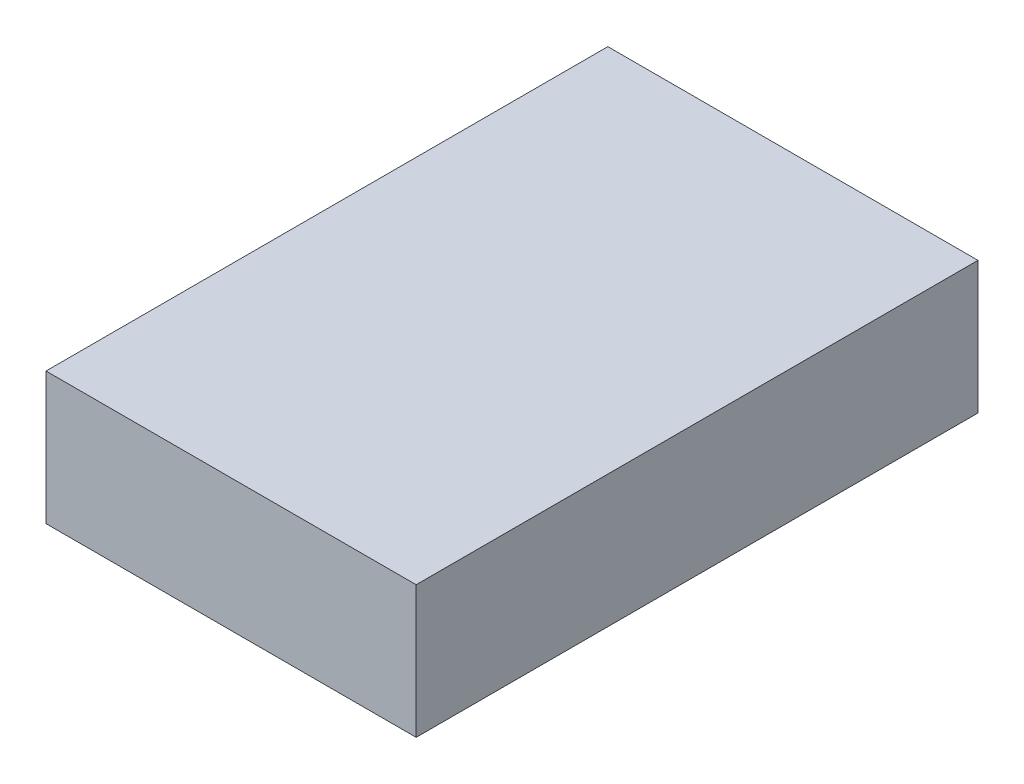
ISO-10303-21;
HEADER;
FILE_DESCRIPTION(('STEP AP214'),'2;1');
FILE_NAME('part.step','',(''),(''),'','','');
FILE_SCHEMA(('AUTOMOTIVE_DESIGN { 1 0 10303 214 1 1 1 1 }'));
ENDSEC;
DATA;
#1=APPLICATION_CONTEXT('core data for automotive mechanical design processes');
#2=APPLICATION_PROTOCOL_DEFINITION('international standard','automotive_design',2000,#1);
#3=PRODUCT_CONTEXT('',#1,'mechanical');
#4=PRODUCT('Part','Part','',(#3));
#5=PRODUCT_RELATED_PRODUCT_CATEGORY('part','',(#4));
#6=PRODUCT_DEFINITION_FORMATION('','',#4);
#7=PRODUCT_DEFINITION_CONTEXT('part definition',#1,'design');
#8=PRODUCT_DEFINITION('design','',#6,#7);
#9=PRODUCT_DEFINITION_SHAPE('','',#8);
#10=(LENGTH_UNIT() NAMED_UNIT(*) SI_UNIT(.MILLI.,.METRE.));
#11=(NAMED_UNIT(*) PLANE_ANGLE_UNIT() SI_UNIT($,.RADIAN.));
#12=(NAMED_UNIT(*) SI_UNIT($,.STERADIAN.) SOLID_ANGLE_UNIT());
#13=UNCERTAINTY_MEASURE_WITH_UNIT(LENGTH_MEASURE(1.E-05),#10,'distance_accuracy_value','');
#14=(GEOMETRIC_REPRESENTATION_CONTEXT(3) GLOBAL_UNCERTAINTY_ASSIGNED_CONTEXT((#13)) GLOBAL_UNIT_ASSIGNED_CONTEXT((#10,
#11,#12)) REPRESENTATION_CONTEXT('',''));
#15=CARTESIAN_POINT('',(0.,0.,0.));
#16=DIRECTION('',(0.,0.,1.));
#17=DIRECTION('',(1.,0.,0.));
#18=AXIS2_PLACEMENT_3D('',#15,#16,#17);
#19=CARTESIAN_POINT('',(0.,40.,0.));
#20=DIRECTION('',(1.,0.,0.));
#21=DIRECTION('',(0.,0.,-1.));
#22=AXIS2_PLACEMENT_3D('',#19,#20,#21);
#23=PLANE('',#22);
#24=DIRECTION('',(0.,0.,1.));
#25=VECTOR('',#24,1.);
#26=CARTESIAN_POINT('',(0.,0.,0.));
#27=LINE('',#26,#25);
#28=CARTESIAN_POINT('',(0.,0.,-170.));
#29=VERTEX_POINT('',#28);
#30=CARTESIAN_POINT('',(0.,0.,0.));
#31=VERTEX_POINT('',#30);
#32=EDGE_CURVE('E113',#29,#31,#27,.T.);
#33=ORIENTED_EDGE('',*,*,#32,.T.);
#34=DIRECTION('',(0.,-1.,0.));
#35=VECTOR('',#34,1.);
#36=CARTESIAN_POINT('',(0.,40.,0.));
#37=LINE('',#36,#35);
#38=CARTESIAN_POINT('',(0.,40.,0.));
#39=VERTEX_POINT('',#38);
#40=EDGE_CURVE('E11',#39,#31,#37,.T.);
#41=ORIENTED_EDGE('',*,*,#40,.F.);
#42=DIRECTION('',(0.,0.,1.));
#43=VECTOR('',#42,1.);
#44=CARTESIAN_POINT('',(0.,40.,0.));
#45=LINE('',#44,#43);
#46=CARTESIAN_POINT('',(0.,40.,-170.));
#47=VERTEX_POINT('',#46);
#48=EDGE_CURVE('E97',#47,#39,#45,.T.);
#49=ORIENTED_EDGE('',*,*,#48,.F.);
#50=DIRECTION('',(0.,-1.,0.));
#51=VECTOR('',#50,1.);
#52=CARTESIAN_POINT('',(0.,40.,-170.));
#53=LINE('',#52,#51);
#54=EDGE_CURVE('E109',#47,#29,#53,.T.);
#55=ORIENTED_EDGE('',*,*,#54,.T.);
#56=EDGE_LOOP('',(#33,#41,#49,#55));
#57=FACE_BOUND('',#56,.T.);
#58=ADVANCED_FACE('F45',(#57),#23,.F.);
#59=CARTESIAN_POINT('',(0.,40.,0.));
#60=DIRECTION('',(0.,0.,-1.));
#61=DIRECTION('',(-1.,0.,0.));
#62=AXIS2_PLACEMENT_3D('',#59,#60,#61);
#63=PLANE('',#62);
#64=DIRECTION('',(1.,0.,0.));
#65=VECTOR('',#64,1.);
#66=CARTESIAN_POINT('',(0.,0.,0.));
#67=LINE('',#66,#65);
#68=CARTESIAN_POINT('',(112.,0.,0.));
#69=VERTEX_POINT('',#68);
#70=EDGE_CURVE('E102',#31,#69,#67,.T.);
#71=ORIENTED_EDGE('',*,*,#70,.T.);
#72=DIRECTION('',(0.,-1.,0.));
#73=VECTOR('',#72,1.);
#74=CARTESIAN_POINT('',(112.,40.,0.));
#75=LINE('',#74,#73);
#76=CARTESIAN_POINT('',(112.,40.,0.));
#77=VERTEX_POINT('',#76);
#78=EDGE_CURVE('E54',#77,#69,#75,.T.);
#79=ORIENTED_EDGE('',*,*,#78,.F.);
#80=DIRECTION('',(1.,0.,0.));
#81=VECTOR('',#80,1.);
#82=CARTESIAN_POINT('',(0.,40.,0.));
#83=LINE('',#82,#81);
#84=EDGE_CURVE('E92',#39,#77,#83,.T.);
#85=ORIENTED_EDGE('',*,*,#84,.F.);
#86=ORIENTED_EDGE('',*,*,#40,.T.);
#87=EDGE_LOOP('',(#71,#79,#85,#86));
#88=FACE_BOUND('',#87,.T.);
#89=ADVANCED_FACE('F101',(#88),#63,.F.);
#90=CARTESIAN_POINT('',(112.,40.,0.));
#91=DIRECTION('',(-1.,0.,0.));
#92=DIRECTION('',(0.,0.,1.));
#93=AXIS2_PLACEMENT_3D('',#90,#91,#92);
#94=PLANE('',#93);
#95=DIRECTION('',(0.,0.,-1.));
#96=VECTOR('',#95,1.);
#97=CARTESIAN_POINT('',(112.,0.,0.));
#98=LINE('',#97,#96);
#99=CARTESIAN_POINT('',(112.,0.,-170.));
#100=VERTEX_POINT('',#99);
#101=EDGE_CURVE('E79',#69,#100,#98,.T.);
#102=ORIENTED_EDGE('',*,*,#101,.T.);
#103=DIRECTION('',(0.,-1.,0.));
#104=VECTOR('',#103,1.);
#105=CARTESIAN_POINT('',(112.,40.,-170.));
#106=LINE('',#105,#104);
#107=CARTESIAN_POINT('',(112.,40.,-170.));
#108=VERTEX_POINT('',#107);
#109=EDGE_CURVE('E104',#108,#100,#106,.T.);
#110=ORIENTED_EDGE('',*,*,#109,.F.);
#111=DIRECTION('',(0.,0.,-1.));
#112=VECTOR('',#111,1.);
#113=CARTESIAN_POINT('',(112.,40.,0.));
#114=LINE('',#113,#112);
#115=EDGE_CURVE('E95',#77,#108,#114,.T.);
#116=ORIENTED_EDGE('',*,*,#115,.F.);
#117=ORIENTED_EDGE('',*,*,#78,.T.);
#118=EDGE_LOOP('',(#102,#110,#116,#117));
#119=FACE_BOUND('',#118,.T.);
#120=ADVANCED_FACE('F105',(#119),#94,.F.);
#121=CARTESIAN_POINT('',(0.,40.,-170.));
#122=DIRECTION('',(0.,0.,1.));
#123=DIRECTION('',(1.,0.,0.));
#124=AXIS2_PLACEMENT_3D('',#121,#122,#123);
#125=PLANE('',#124);
#126=DIRECTION('',(-1.,0.,0.));
#127=VECTOR('',#126,1.);
#128=CARTESIAN_POINT('',(0.,0.,-170.));
#129=LINE('',#128,#127);
#130=EDGE_CURVE('E85',#100,#29,#129,.T.);
#131=ORIENTED_EDGE('',*,*,#130,.T.);
#132=ORIENTED_EDGE('',*,*,#54,.F.);
#133=DIRECTION('',(-1.,0.,0.));
#134=VECTOR('',#133,1.);
#135=CARTESIAN_POINT('',(0.,40.,-170.));
#136=LINE('',#135,#134);
#137=EDGE_CURVE('E62',#108,#47,#136,.T.);
#138=ORIENTED_EDGE('',*,*,#137,.F.);
#139=ORIENTED_EDGE('',*,*,#109,.T.);
#140=EDGE_LOOP('',(#131,#132,#138,#139));
#141=FACE_BOUND('',#140,.T.);
#142=ADVANCED_FACE('F126',(#141),#125,.F.);
#143=CARTESIAN_POINT('',(0.,40.,0.));
#144=DIRECTION('',(0.,-1.,0.));
#145=DIRECTION('',(0.,0.,-1.));
#146=AXIS2_PLACEMENT_3D('',#143,#144,#145);
#147=PLANE('',#146);
#148=ORIENTED_EDGE('',*,*,#48,.T.);
#149=ORIENTED_EDGE('',*,*,#84,.T.);
#150=ORIENTED_EDGE('',*,*,#115,.T.);
#151=ORIENTED_EDGE('',*,*,#137,.T.);
#152=EDGE_LOOP('',(#148,#149,#150,#151));
#153=FACE_BOUND('',#152,.T.);
#154=ADVANCED_FACE('F93',(#153),#147,.F.);
#155=CARTESIAN_POINT('',(0.,0.,0.));
#156=DIRECTION('',(0.,-1.,0.));
#157=DIRECTION('',(0.,0.,-1.));
#158=AXIS2_PLACEMENT_3D('',#155,#156,#157);
#159=PLANE('',#158);
#160=ORIENTED_EDGE('',*,*,#32,.F.);
#161=ORIENTED_EDGE('',*,*,#130,.F.);
#162=ORIENTED_EDGE('',*,*,#101,.F.);
#163=ORIENTED_EDGE('',*,*,#70,.F.);
#164=EDGE_LOOP('',(#160,#161,#162,#163));
#165=FACE_BOUND('',#164,.T.);
#166=ADVANCED_FACE('F129',(#165),#159,.T.);
#167=CLOSED_SHELL('',(#58,#89,#120,#142,#154,#166));
#168=MANIFOLD_SOLID_BREP('B2',#167);
#169=ADVANCED_BREP_SHAPE_REPRESENTATION('',(#18,#168),#14);
#170=SHAPE_DEFINITION_REPRESENTATION(#9,#169);
ENDSEC;
END-ISO-10303-21;
